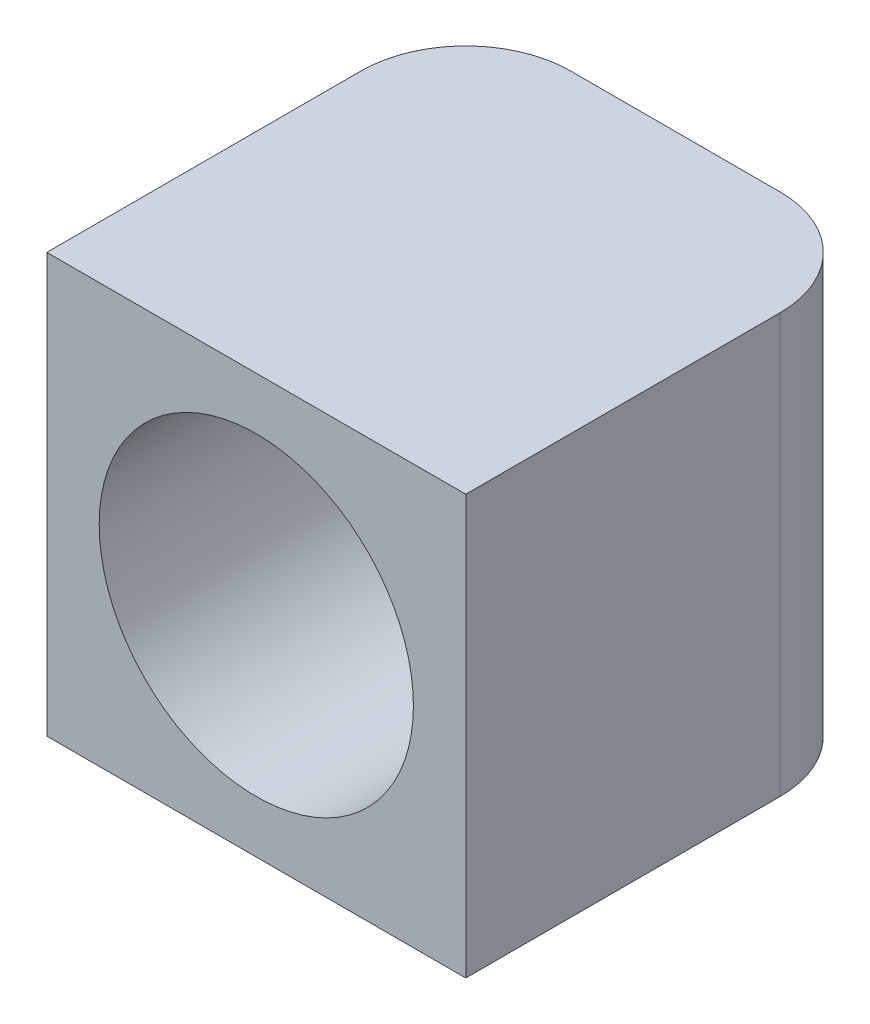
ISO-10303-21;
HEADER;
FILE_DESCRIPTION(('STEP AP214'),'2;1');
FILE_NAME('part.step','',(''),(''),'','','');
FILE_SCHEMA(('AUTOMOTIVE_DESIGN { 1 0 10303 214 1 1 1 1 }'));
ENDSEC;
DATA;
#1=APPLICATION_CONTEXT('core data for automotive mechanical design processes');
#2=APPLICATION_PROTOCOL_DEFINITION('international standard','automotive_design',2000,#1);
#3=PRODUCT_CONTEXT('',#1,'mechanical');
#4=PRODUCT('Part','Part','',(#3));
#5=PRODUCT_RELATED_PRODUCT_CATEGORY('part','',(#4));
#6=PRODUCT_DEFINITION_FORMATION('','',#4);
#7=PRODUCT_DEFINITION_CONTEXT('part definition',#1,'design');
#8=PRODUCT_DEFINITION('design','',#6,#7);
#9=PRODUCT_DEFINITION_SHAPE('','',#8);
#10=(LENGTH_UNIT() NAMED_UNIT(*) SI_UNIT(.MILLI.,.METRE.));
#11=(NAMED_UNIT(*) PLANE_ANGLE_UNIT() SI_UNIT($,.RADIAN.));
#12=(NAMED_UNIT(*) SI_UNIT($,.STERADIAN.) SOLID_ANGLE_UNIT());
#13=UNCERTAINTY_MEASURE_WITH_UNIT(LENGTH_MEASURE(1.E-05),#10,'distance_accuracy_value','');
#14=(GEOMETRIC_REPRESENTATION_CONTEXT(3) GLOBAL_UNCERTAINTY_ASSIGNED_CONTEXT((#13)) GLOBAL_UNIT_ASSIGNED_CONTEXT((#10,
#11,#12)) REPRESENTATION_CONTEXT('',''));
#15=CARTESIAN_POINT('',(0.,0.,0.));
#16=DIRECTION('',(0.,0.,1.));
#17=DIRECTION('',(1.,0.,0.));
#18=AXIS2_PLACEMENT_3D('',#15,#16,#17);
#19=CARTESIAN_POINT('',(4.,0.,0.));
#20=DIRECTION('',(0.,0.,-1.));
#21=DIRECTION('',(-1.,0.,0.));
#22=AXIS2_PLACEMENT_3D('',#19,#20,#21);
#23=PLANE('',#22);
#24=CARTESIAN_POINT('',(2.,2.,0.));
#25=DIRECTION('',(0.,0.,1.));
#26=DIRECTION('',(1.,0.,0.));
#27=AXIS2_PLACEMENT_3D('',#24,#25,#26);
#28=CIRCLE('',#27,1.5);
#29=CARTESIAN_POINT('',(3.5,2.,0.));
#30=VERTEX_POINT('',#29);
#31=EDGE_CURVE('E145',#30,#30,#28,.T.);
#32=ORIENTED_EDGE('',*,*,#31,.F.);
#33=EDGE_LOOP('',(#32));
#34=FACE_BOUND('',#33,.T.);
#35=DIRECTION('',(0.,-1.,0.));
#36=VECTOR('',#35,1.);
#37=CARTESIAN_POINT('',(0.,0.,0.));
#38=LINE('',#37,#36);
#39=CARTESIAN_POINT('',(0.,4.,0.));
#40=VERTEX_POINT('',#39);
#41=CARTESIAN_POINT('',(0.,0.,0.));
#42=VERTEX_POINT('',#41);
#43=EDGE_CURVE('E106',#40,#42,#38,.T.);
#44=ORIENTED_EDGE('',*,*,#43,.T.);
#45=DIRECTION('',(-1.,0.,0.));
#46=VECTOR('',#45,1.);
#47=CARTESIAN_POINT('',(4.,0.,0.));
#48=LINE('',#47,#46);
#49=CARTESIAN_POINT('',(4.,0.,0.));
#50=VERTEX_POINT('',#49);
#51=EDGE_CURVE('E90',#50,#42,#48,.T.);
#52=ORIENTED_EDGE('',*,*,#51,.F.);
#53=DIRECTION('',(0.,-1.,0.));
#54=VECTOR('',#53,1.);
#55=CARTESIAN_POINT('',(4.,0.,0.));
#56=LINE('',#55,#54);
#57=CARTESIAN_POINT('',(4.,4.,0.));
#58=VERTEX_POINT('',#57);
#59=EDGE_CURVE('E95',#58,#50,#56,.T.);
#60=ORIENTED_EDGE('',*,*,#59,.F.);
#61=DIRECTION('',(-1.,0.,0.));
#62=VECTOR('',#61,1.);
#63=CARTESIAN_POINT('',(4.,4.,0.));
#64=LINE('',#63,#62);
#65=EDGE_CURVE('E141',#58,#40,#64,.T.);
#66=ORIENTED_EDGE('',*,*,#65,.T.);
#67=EDGE_LOOP('',(#44,#52,#60,#66));
#68=FACE_BOUND('',#67,.T.);
#69=ADVANCED_FACE('F33',(#34,#68),#23,.F.);
#70=CARTESIAN_POINT('',(4.,0.,0.));
#71=DIRECTION('',(0.,1.,0.));
#72=DIRECTION('',(0.,0.,1.));
#73=AXIS2_PLACEMENT_3D('',#70,#71,#72);
#74=PLANE('',#73);
#75=DIRECTION('',(0.,0.,-1.));
#76=VECTOR('',#75,1.);
#77=CARTESIAN_POINT('',(0.,0.,0.));
#78=LINE('',#77,#76);
#79=CARTESIAN_POINT('',(0.,0.,-3.));
#80=VERTEX_POINT('',#79);
#81=EDGE_CURVE('E125',#42,#80,#78,.T.);
#82=ORIENTED_EDGE('',*,*,#81,.T.);
#83=CARTESIAN_POINT('',(1.,0.,-3.));
#84=DIRECTION('',(0.,1.,0.));
#85=DIRECTION('',(0.,0.,1.));
#86=AXIS2_PLACEMENT_3D('',#83,#84,#85);
#87=CIRCLE('',#86,1.);
#88=CARTESIAN_POINT('',(1.,0.,-4.));
#89=VERTEX_POINT('',#88);
#90=EDGE_CURVE('E41',#80,#89,#87,.F.);
#91=ORIENTED_EDGE('',*,*,#90,.T.);
#92=DIRECTION('',(-1.,0.,0.));
#93=VECTOR('',#92,1.);
#94=CARTESIAN_POINT('',(4.,0.,-4.));
#95=LINE('',#94,#93);
#96=CARTESIAN_POINT('',(3.,0.,-4.));
#97=VERTEX_POINT('',#96);
#98=EDGE_CURVE('E108',#97,#89,#95,.T.);
#99=ORIENTED_EDGE('',*,*,#98,.F.);
#100=CARTESIAN_POINT('',(3.,0.,-3.));
#101=DIRECTION('',(0.,1.,0.));
#102=DIRECTION('',(0.,0.,1.));
#103=AXIS2_PLACEMENT_3D('',#100,#101,#102);
#104=CIRCLE('',#103,1.);
#105=CARTESIAN_POINT('',(4.,0.,-3.));
#106=VERTEX_POINT('',#105);
#107=EDGE_CURVE('E48',#97,#106,#104,.F.);
#108=ORIENTED_EDGE('',*,*,#107,.T.);
#109=DIRECTION('',(0.,0.,-1.));
#110=VECTOR('',#109,1.);
#111=CARTESIAN_POINT('',(4.,0.,0.));
#112=LINE('',#111,#110);
#113=EDGE_CURVE('E86',#50,#106,#112,.T.);
#114=ORIENTED_EDGE('',*,*,#113,.F.);
#115=ORIENTED_EDGE('',*,*,#51,.T.);
#116=EDGE_LOOP('',(#82,#91,#99,#108,#114,#115));
#117=FACE_BOUND('',#116,.T.);
#118=ADVANCED_FACE('F88',(#117),#74,.F.);
#119=CARTESIAN_POINT('',(4.,0.,-4.));
#120=DIRECTION('',(0.,0.,1.));
#121=DIRECTION('',(0.,-1.,0.));
#122=AXIS2_PLACEMENT_3D('',#119,#120,#121);
#123=PLANE('',#122);
#124=ORIENTED_EDGE('',*,*,#98,.T.);
#125=DIRECTION('',(0.,1.,0.));
#126=VECTOR('',#125,1.);
#127=CARTESIAN_POINT('',(1.,4.,-4.));
#128=LINE('',#127,#126);
#129=CARTESIAN_POINT('',(1.,4.,-4.));
#130=VERTEX_POINT('',#129);
#131=EDGE_CURVE('E110',#89,#130,#128,.T.);
#132=ORIENTED_EDGE('',*,*,#131,.T.);
#133=DIRECTION('',(-1.,0.,0.));
#134=VECTOR('',#133,1.);
#135=CARTESIAN_POINT('',(4.,4.,-4.));
#136=LINE('',#135,#134);
#137=CARTESIAN_POINT('',(3.,4.,-4.));
#138=VERTEX_POINT('',#137);
#139=EDGE_CURVE('E113',#138,#130,#136,.T.);
#140=ORIENTED_EDGE('',*,*,#139,.F.);
#141=DIRECTION('',(0.,1.,0.));
#142=VECTOR('',#141,1.);
#143=CARTESIAN_POINT('',(3.,0.,-4.));
#144=LINE('',#143,#142);
#145=EDGE_CURVE('E107',#138,#97,#144,.F.);
#146=ORIENTED_EDGE('',*,*,#145,.T.);
#147=EDGE_LOOP('',(#124,#132,#140,#146));
#148=FACE_BOUND('',#147,.T.);
#149=ADVANCED_FACE('F129',(#148),#123,.F.);
#150=CARTESIAN_POINT('',(4.,4.,0.));
#151=DIRECTION('',(0.,-1.,0.));
#152=DIRECTION('',(0.,0.,-1.));
#153=AXIS2_PLACEMENT_3D('',#150,#151,#152);
#154=PLANE('',#153);
#155=ORIENTED_EDGE('',*,*,#139,.T.);
#156=CARTESIAN_POINT('',(1.,4.,-3.));
#157=DIRECTION('',(0.,-1.,0.));
#158=DIRECTION('',(0.,0.,-1.));
#159=AXIS2_PLACEMENT_3D('',#156,#157,#158);
#160=CIRCLE('',#159,1.);
#161=CARTESIAN_POINT('',(0.,4.,-3.));
#162=VERTEX_POINT('',#161);
#163=EDGE_CURVE('E121',#130,#162,#160,.F.);
#164=ORIENTED_EDGE('',*,*,#163,.T.);
#165=DIRECTION('',(0.,0.,1.));
#166=VECTOR('',#165,1.);
#167=CARTESIAN_POINT('',(0.,4.,0.));
#168=LINE('',#167,#166);
#169=EDGE_CURVE('E103',#162,#40,#168,.T.);
#170=ORIENTED_EDGE('',*,*,#169,.T.);
#171=ORIENTED_EDGE('',*,*,#65,.F.);
#172=DIRECTION('',(0.,0.,1.));
#173=VECTOR('',#172,1.);
#174=CARTESIAN_POINT('',(4.,4.,0.));
#175=LINE('',#174,#173);
#176=CARTESIAN_POINT('',(4.,4.,-3.));
#177=VERTEX_POINT('',#176);
#178=EDGE_CURVE('E94',#177,#58,#175,.T.);
#179=ORIENTED_EDGE('',*,*,#178,.F.);
#180=CARTESIAN_POINT('',(3.,4.,-3.));
#181=DIRECTION('',(0.,-1.,0.));
#182=DIRECTION('',(0.,0.,-1.));
#183=AXIS2_PLACEMENT_3D('',#180,#181,#182);
#184=CIRCLE('',#183,1.);
#185=EDGE_CURVE('E119',#177,#138,#184,.F.);
#186=ORIENTED_EDGE('',*,*,#185,.T.);
#187=EDGE_LOOP('',(#155,#164,#170,#171,#179,#186));
#188=FACE_BOUND('',#187,.T.);
#189=ADVANCED_FACE('F135',(#188),#154,.F.);
#190=CARTESIAN_POINT('',(4.,0.,0.));
#191=DIRECTION('',(-1.,0.,0.));
#192=DIRECTION('',(0.,0.,1.));
#193=AXIS2_PLACEMENT_3D('',#190,#191,#192);
#194=PLANE('',#193);
#195=ORIENTED_EDGE('',*,*,#113,.T.);
#196=DIRECTION('',(0.,1.,0.));
#197=VECTOR('',#196,1.);
#198=CARTESIAN_POINT('',(4.,0.,-3.));
#199=LINE('',#198,#197);
#200=EDGE_CURVE('E11',#106,#177,#199,.T.);
#201=ORIENTED_EDGE('',*,*,#200,.T.);
#202=ORIENTED_EDGE('',*,*,#178,.T.);
#203=ORIENTED_EDGE('',*,*,#59,.T.);
#204=EDGE_LOOP('',(#195,#201,#202,#203));
#205=FACE_BOUND('',#204,.T.);
#206=ADVANCED_FACE('F98',(#205),#194,.F.);
#207=CARTESIAN_POINT('',(0.,0.,0.));
#208=DIRECTION('',(-1.,0.,0.));
#209=DIRECTION('',(0.,0.,1.));
#210=AXIS2_PLACEMENT_3D('',#207,#208,#209);
#211=PLANE('',#210);
#212=ORIENTED_EDGE('',*,*,#169,.F.);
#213=DIRECTION('',(0.,1.,0.));
#214=VECTOR('',#213,1.);
#215=CARTESIAN_POINT('',(0.,0.,-3.));
#216=LINE('',#215,#214);
#217=EDGE_CURVE('E56',#162,#80,#216,.F.);
#218=ORIENTED_EDGE('',*,*,#217,.T.);
#219=ORIENTED_EDGE('',*,*,#81,.F.);
#220=ORIENTED_EDGE('',*,*,#43,.F.);
#221=EDGE_LOOP('',(#212,#218,#219,#220));
#222=FACE_BOUND('',#221,.T.);
#223=ADVANCED_FACE('F136',(#222),#211,.T.);
#224=CARTESIAN_POINT('',(1.,0.,-3.));
#225=DIRECTION('',(0.,-1.,0.));
#226=DIRECTION('',(0.,0.,-1.));
#227=AXIS2_PLACEMENT_3D('',#224,#225,#226);
#228=CYLINDRICAL_SURFACE('',#227,1.);
#229=ORIENTED_EDGE('',*,*,#90,.F.);
#230=ORIENTED_EDGE('',*,*,#217,.F.);
#231=ORIENTED_EDGE('',*,*,#163,.F.);
#232=ORIENTED_EDGE('',*,*,#131,.F.);
#233=EDGE_LOOP('',(#229,#230,#231,#232));
#234=FACE_BOUND('',#233,.T.);
#235=ADVANCED_FACE('F133',(#234),#228,.T.);
#236=CARTESIAN_POINT('',(3.,0.,-3.));
#237=DIRECTION('',(0.,1.,0.));
#238=DIRECTION('',(0.,0.,1.));
#239=AXIS2_PLACEMENT_3D('',#236,#237,#238);
#240=CYLINDRICAL_SURFACE('',#239,1.);
#241=ORIENTED_EDGE('',*,*,#107,.F.);
#242=ORIENTED_EDGE('',*,*,#145,.F.);
#243=ORIENTED_EDGE('',*,*,#185,.F.);
#244=ORIENTED_EDGE('',*,*,#200,.F.);
#245=EDGE_LOOP('',(#241,#242,#243,#244));
#246=FACE_BOUND('',#245,.T.);
#247=ADVANCED_FACE('F35',(#246),#240,.T.);
#248=CARTESIAN_POINT('',(2.,2.,-3.));
#249=DIRECTION('',(0.,0.,1.));
#250=DIRECTION('',(1.,0.,0.));
#251=AXIS2_PLACEMENT_3D('',#248,#249,#250);
#252=CYLINDRICAL_SURFACE('',#251,1.5);
#253=CARTESIAN_POINT('',(2.,2.,-3.));
#254=DIRECTION('',(0.,0.,1.));
#255=DIRECTION('',(1.,0.,0.));
#256=AXIS2_PLACEMENT_3D('',#253,#254,#255);
#257=CIRCLE('',#256,1.5);
#258=CARTESIAN_POINT('',(3.5,2.,-3.));
#259=VERTEX_POINT('',#258);
#260=EDGE_CURVE('E143',#259,#259,#257,.T.);
#261=ORIENTED_EDGE('',*,*,#260,.F.);
#262=EDGE_LOOP('',(#261));
#263=FACE_BOUND('',#262,.T.);
#264=ORIENTED_EDGE('',*,*,#31,.T.);
#265=EDGE_LOOP('',(#264));
#266=FACE_BOUND('',#265,.T.);
#267=ADVANCED_FACE('F153',(#263,#266),#252,.F.);
#268=CARTESIAN_POINT('',(2.,2.,-3.));
#269=DIRECTION('',(0.,0.,1.));
#270=DIRECTION('',(1.,0.,0.));
#271=AXIS2_PLACEMENT_3D('',#268,#269,#270);
#272=PLANE('',#271);
#273=ORIENTED_EDGE('',*,*,#260,.T.);
#274=EDGE_LOOP('',(#273));
#275=FACE_BOUND('',#274,.T.);
#276=ADVANCED_FACE('F217',(#275),#272,.T.);
#277=CLOSED_SHELL('',(#69,#118,#149,#189,#206,#223,#235,#247,#267,#276));
#278=MANIFOLD_SOLID_BREP('B2',#277);
#279=ADVANCED_BREP_SHAPE_REPRESENTATION('',(#18,#278),#14);
#280=SHAPE_DEFINITION_REPRESENTATION(#9,#279);
ENDSEC;
END-ISO-10303-21;
